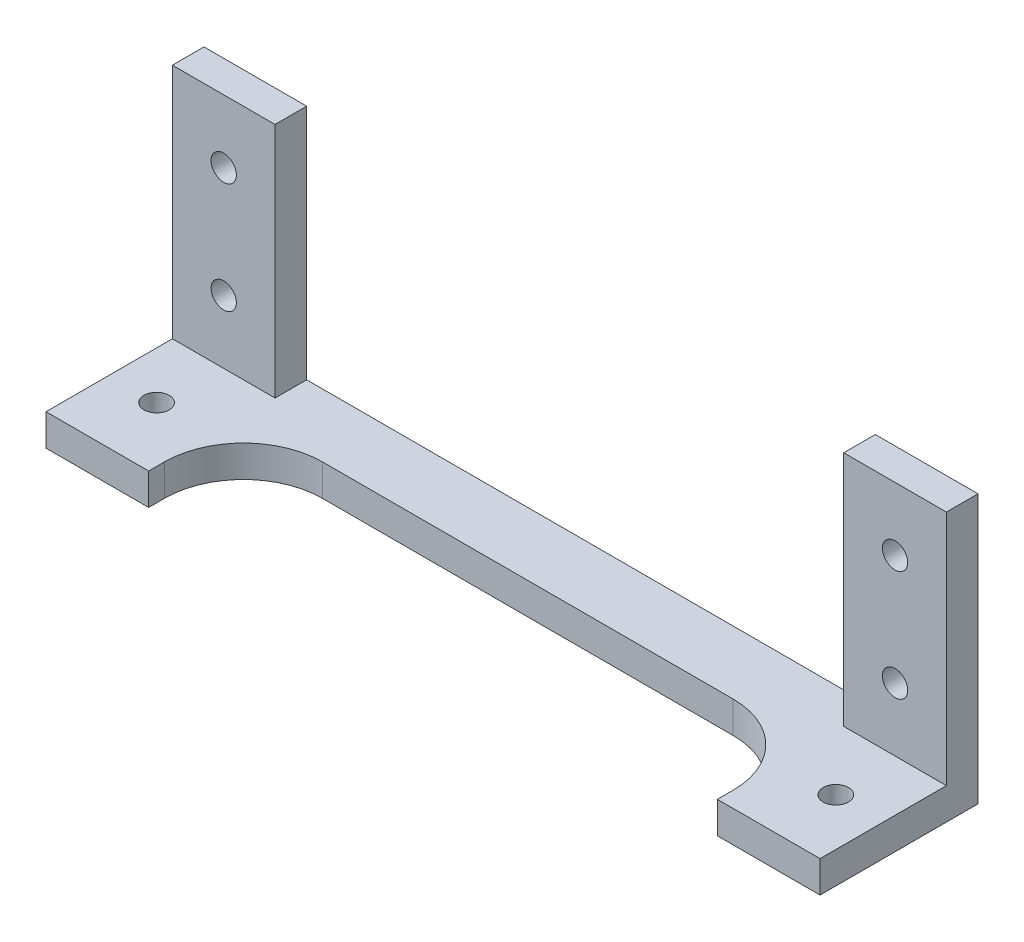
ISO-10303-21;
HEADER;
FILE_DESCRIPTION(('STEP AP214'),'2;1');
FILE_NAME('part.step','',(''),(''),'','','');
FILE_SCHEMA(('AUTOMOTIVE_DESIGN { 1 0 10303 214 1 1 1 1 }'));
ENDSEC;
DATA;
#1=APPLICATION_CONTEXT('core data for automotive mechanical design processes');
#2=APPLICATION_PROTOCOL_DEFINITION('international standard','automotive_design',2000,#1);
#3=PRODUCT_CONTEXT('',#1,'mechanical');
#4=PRODUCT('Part','Part','',(#3));
#5=PRODUCT_RELATED_PRODUCT_CATEGORY('part','',(#4));
#6=PRODUCT_DEFINITION_FORMATION('','',#4);
#7=PRODUCT_DEFINITION_CONTEXT('part definition',#1,'design');
#8=PRODUCT_DEFINITION('design','',#6,#7);
#9=PRODUCT_DEFINITION_SHAPE('','',#8);
#10=(LENGTH_UNIT() NAMED_UNIT(*) SI_UNIT(.MILLI.,.METRE.));
#11=(NAMED_UNIT(*) PLANE_ANGLE_UNIT() SI_UNIT($,.RADIAN.));
#12=(NAMED_UNIT(*) SI_UNIT($,.STERADIAN.) SOLID_ANGLE_UNIT());
#13=UNCERTAINTY_MEASURE_WITH_UNIT(LENGTH_MEASURE(1.E-05),#10,'distance_accuracy_value','');
#14=(GEOMETRIC_REPRESENTATION_CONTEXT(3) GLOBAL_UNCERTAINTY_ASSIGNED_CONTEXT((#13)) GLOBAL_UNIT_ASSIGNED_CONTEXT((#10,
#11,#12)) REPRESENTATION_CONTEXT('',''));
#15=CARTESIAN_POINT('',(0.,0.,0.));
#16=DIRECTION('',(0.,0.,1.));
#17=DIRECTION('',(1.,0.,0.));
#18=AXIS2_PLACEMENT_3D('',#15,#16,#17);
#19=CARTESIAN_POINT('',(0.,0.,10.));
#20=DIRECTION('',(0.,0.,-1.));
#21=DIRECTION('',(-1.,0.,0.));
#22=AXIS2_PLACEMENT_3D('',#19,#20,#21);
#23=PLANE('',#22);
#24=DIRECTION('',(1.,0.,0.));
#25=VECTOR('',#24,1.);
#26=CARTESIAN_POINT('',(0.,0.,10.));
#27=LINE('',#26,#25);
#28=CARTESIAN_POINT('',(0.,0.,10.));
#29=VERTEX_POINT('',#28);
#30=CARTESIAN_POINT('',(6.5,0.,10.));
#31=VERTEX_POINT('',#30);
#32=EDGE_CURVE('E238',#29,#31,#27,.T.);
#33=ORIENTED_EDGE('',*,*,#32,.T.);
#34=DIRECTION('',(0.,1.,0.));
#35=VECTOR('',#34,1.);
#36=CARTESIAN_POINT('',(6.5,0.,10.));
#37=LINE('',#36,#35);
#38=CARTESIAN_POINT('',(6.5,2.,10.));
#39=VERTEX_POINT('',#38);
#40=EDGE_CURVE('E190',#31,#39,#37,.T.);
#41=ORIENTED_EDGE('',*,*,#40,.T.);
#42=DIRECTION('',(-1.,0.,0.));
#43=VECTOR('',#42,1.);
#44=CARTESIAN_POINT('',(0.,2.,10.));
#45=LINE('',#44,#43);
#46=CARTESIAN_POINT('',(0.,2.,10.));
#47=VERTEX_POINT('',#46);
#48=EDGE_CURVE('E243',#39,#47,#45,.T.);
#49=ORIENTED_EDGE('',*,*,#48,.T.);
#50=DIRECTION('',(0.,-1.,0.));
#51=VECTOR('',#50,1.);
#52=CARTESIAN_POINT('',(0.,0.,10.));
#53=LINE('',#52,#51);
#54=EDGE_CURVE('E235',#47,#29,#53,.T.);
#55=ORIENTED_EDGE('',*,*,#54,.T.);
#56=EDGE_LOOP('',(#33,#41,#49,#55));
#57=FACE_BOUND('',#56,.T.);
#58=ADVANCED_FACE('F34',(#57),#23,.F.);
#59=CARTESIAN_POINT('',(0.,0.,2.));
#60=DIRECTION('',(0.,0.,-1.));
#61=DIRECTION('',(-1.,0.,0.));
#62=AXIS2_PLACEMENT_3D('',#59,#60,#61);
#63=PLANE('',#62);
#64=CARTESIAN_POINT('',(45.75,6.,2.));
#65=DIRECTION('',(0.,0.,1.));
#66=DIRECTION('',(1.,0.,0.));
#67=AXIS2_PLACEMENT_3D('',#64,#65,#66);
#68=CIRCLE('',#67,0.799999999999996);
#69=CARTESIAN_POINT('',(46.55,6.,2.));
#70=VERTEX_POINT('',#69);
#71=EDGE_CURVE('E209',#70,#70,#68,.T.);
#72=ORIENTED_EDGE('',*,*,#71,.F.);
#73=EDGE_LOOP('',(#72));
#74=FACE_BOUND('',#73,.T.);
#75=CARTESIAN_POINT('',(45.75,13.,2.));
#76=DIRECTION('',(0.,0.,1.));
#77=DIRECTION('',(1.,0.,0.));
#78=AXIS2_PLACEMENT_3D('',#75,#76,#77);
#79=CIRCLE('',#78,0.799999999999996);
#80=CARTESIAN_POINT('',(46.55,13.,2.));
#81=VERTEX_POINT('',#80);
#82=EDGE_CURVE('E215',#81,#81,#79,.T.);
#83=ORIENTED_EDGE('',*,*,#82,.F.);
#84=EDGE_LOOP('',(#83));
#85=FACE_BOUND('',#84,.T.);
#86=DIRECTION('',(-1.,0.,0.));
#87=VECTOR('',#86,1.);
#88=CARTESIAN_POINT('',(0.,2.,2.));
#89=LINE('',#88,#87);
#90=CARTESIAN_POINT('',(49.,2.,2.));
#91=VERTEX_POINT('',#90);
#92=CARTESIAN_POINT('',(42.5,2.,2.));
#93=VERTEX_POINT('',#92);
#94=EDGE_CURVE('E59',#91,#93,#89,.T.);
#95=ORIENTED_EDGE('',*,*,#94,.F.);
#96=DIRECTION('',(0.,1.,0.));
#97=VECTOR('',#96,1.);
#98=CARTESIAN_POINT('',(49.,0.,2.));
#99=LINE('',#98,#97);
#100=CARTESIAN_POINT('',(49.,17.,2.));
#101=VERTEX_POINT('',#100);
#102=EDGE_CURVE('E254',#91,#101,#99,.T.);
#103=ORIENTED_EDGE('',*,*,#102,.T.);
#104=DIRECTION('',(-1.,0.,0.));
#105=VECTOR('',#104,1.);
#106=CARTESIAN_POINT('',(42.5,17.,2.));
#107=LINE('',#106,#105);
#108=CARTESIAN_POINT('',(42.5,17.,2.));
#109=VERTEX_POINT('',#108);
#110=EDGE_CURVE('E276',#101,#109,#107,.T.);
#111=ORIENTED_EDGE('',*,*,#110,.T.);
#112=DIRECTION('',(0.,-1.,0.));
#113=VECTOR('',#112,1.);
#114=CARTESIAN_POINT('',(42.5,2.,2.));
#115=LINE('',#114,#113);
#116=EDGE_CURVE('E272',#109,#93,#115,.T.);
#117=ORIENTED_EDGE('',*,*,#116,.T.);
#118=EDGE_LOOP('',(#95,#103,#111,#117));
#119=FACE_BOUND('',#118,.T.);
#120=ADVANCED_FACE('F329',(#74,#85,#119),#63,.F.);
#121=CARTESIAN_POINT('',(3.25,6.,2.));
#122=DIRECTION('',(0.,0.,1.));
#123=DIRECTION('',(1.,0.,0.));
#124=AXIS2_PLACEMENT_3D('',#121,#122,#123);
#125=CIRCLE('',#124,0.8);
#126=CARTESIAN_POINT('',(4.05,6.,2.));
#127=VERTEX_POINT('',#126);
#128=EDGE_CURVE('E221',#127,#127,#125,.T.);
#129=ORIENTED_EDGE('',*,*,#128,.F.);
#130=EDGE_LOOP('',(#129));
#131=FACE_BOUND('',#130,.T.);
#132=CARTESIAN_POINT('',(3.25,13.,2.));
#133=DIRECTION('',(0.,0.,1.));
#134=DIRECTION('',(1.,0.,0.));
#135=AXIS2_PLACEMENT_3D('',#132,#133,#134);
#136=CIRCLE('',#135,0.8);
#137=CARTESIAN_POINT('',(4.05,13.,2.));
#138=VERTEX_POINT('',#137);
#139=EDGE_CURVE('E227',#138,#138,#136,.T.);
#140=ORIENTED_EDGE('',*,*,#139,.F.);
#141=EDGE_LOOP('',(#140));
#142=FACE_BOUND('',#141,.T.);
#143=CARTESIAN_POINT('',(6.5,2.,2.));
#144=VERTEX_POINT('',#143);
#145=CARTESIAN_POINT('',(0.,2.,2.));
#146=VERTEX_POINT('',#145);
#147=EDGE_CURVE('E11',#144,#146,#89,.T.);
#148=ORIENTED_EDGE('',*,*,#147,.F.);
#149=DIRECTION('',(0.,1.,0.));
#150=VECTOR('',#149,1.);
#151=CARTESIAN_POINT('',(6.5,17.,2.));
#152=LINE('',#151,#150);
#153=CARTESIAN_POINT('',(6.5,17.,2.));
#154=VERTEX_POINT('',#153);
#155=EDGE_CURVE('E269',#144,#154,#152,.T.);
#156=ORIENTED_EDGE('',*,*,#155,.T.);
#157=DIRECTION('',(-1.,0.,0.));
#158=VECTOR('',#157,1.);
#159=CARTESIAN_POINT('',(0.,17.,2.));
#160=LINE('',#159,#158);
#161=CARTESIAN_POINT('',(0.,17.,2.));
#162=VERTEX_POINT('',#161);
#163=EDGE_CURVE('E271',#154,#162,#160,.T.);
#164=ORIENTED_EDGE('',*,*,#163,.T.);
#165=DIRECTION('',(0.,-1.,0.));
#166=VECTOR('',#165,1.);
#167=CARTESIAN_POINT('',(0.,0.,2.));
#168=LINE('',#167,#166);
#169=EDGE_CURVE('E310',#162,#146,#168,.T.);
#170=ORIENTED_EDGE('',*,*,#169,.T.);
#171=EDGE_LOOP('',(#148,#156,#164,#170));
#172=FACE_BOUND('',#171,.T.);
#173=ADVANCED_FACE('F367',(#131,#142,#172),#63,.F.);
#174=CARTESIAN_POINT('',(0.,0.,2.));
#175=DIRECTION('',(1.,0.,0.));
#176=DIRECTION('',(0.,0.,-1.));
#177=AXIS2_PLACEMENT_3D('',#174,#175,#176);
#178=PLANE('',#177);
#179=DIRECTION('',(0.,-1.,0.));
#180=VECTOR('',#179,1.);
#181=CARTESIAN_POINT('',(0.,0.,0.));
#182=LINE('',#181,#180);
#183=CARTESIAN_POINT('',(0.,17.,0.));
#184=VERTEX_POINT('',#183);
#185=CARTESIAN_POINT('',(0.,0.,0.));
#186=VERTEX_POINT('',#185);
#187=EDGE_CURVE('E284',#184,#186,#182,.T.);
#188=ORIENTED_EDGE('',*,*,#187,.T.);
#189=DIRECTION('',(0.,0.,-1.));
#190=VECTOR('',#189,1.);
#191=CARTESIAN_POINT('',(0.,0.,2.));
#192=LINE('',#191,#190);
#193=EDGE_CURVE('E43',#29,#186,#192,.T.);
#194=ORIENTED_EDGE('',*,*,#193,.F.);
#195=ORIENTED_EDGE('',*,*,#54,.F.);
#196=DIRECTION('',(0.,0.,-1.));
#197=VECTOR('',#196,1.);
#198=CARTESIAN_POINT('',(0.,2.,10.));
#199=LINE('',#198,#197);
#200=EDGE_CURVE('E247',#47,#146,#199,.T.);
#201=ORIENTED_EDGE('',*,*,#200,.T.);
#202=ORIENTED_EDGE('',*,*,#169,.F.);
#203=DIRECTION('',(0.,0.,-1.));
#204=VECTOR('',#203,1.);
#205=CARTESIAN_POINT('',(0.,17.,2.));
#206=LINE('',#205,#204);
#207=EDGE_CURVE('E311',#162,#184,#206,.T.);
#208=ORIENTED_EDGE('',*,*,#207,.T.);
#209=EDGE_LOOP('',(#188,#194,#195,#201,#202,#208));
#210=FACE_BOUND('',#209,.T.);
#211=ADVANCED_FACE('F36',(#210),#178,.F.);
#212=CARTESIAN_POINT('',(0.,0.,2.));
#213=DIRECTION('',(0.,1.,0.));
#214=DIRECTION('',(0.,0.,1.));
#215=AXIS2_PLACEMENT_3D('',#212,#213,#214);
#216=PLANE('',#215);
#217=CARTESIAN_POINT('',(46.,0.,6.));
#218=DIRECTION('',(0.,1.,0.));
#219=DIRECTION('',(0.,0.,1.));
#220=AXIS2_PLACEMENT_3D('',#217,#218,#219);
#221=CIRCLE('',#220,0.800000000000002);
#222=CARTESIAN_POINT('',(46.,0.,6.8));
#223=VERTEX_POINT('',#222);
#224=EDGE_CURVE('E200',#223,#223,#221,.T.);
#225=ORIENTED_EDGE('',*,*,#224,.T.);
#226=EDGE_LOOP('',(#225));
#227=FACE_BOUND('',#226,.T.);
#228=CARTESIAN_POINT('',(3.,0.,6.));
#229=DIRECTION('',(0.,1.,0.));
#230=DIRECTION('',(0.,0.,1.));
#231=AXIS2_PLACEMENT_3D('',#228,#229,#230);
#232=CIRCLE('',#231,0.800000000000001);
#233=CARTESIAN_POINT('',(3.,0.,6.8));
#234=VERTEX_POINT('',#233);
#235=EDGE_CURVE('E206',#234,#234,#232,.T.);
#236=ORIENTED_EDGE('',*,*,#235,.T.);
#237=EDGE_LOOP('',(#236));
#238=FACE_BOUND('',#237,.T.);
#239=CARTESIAN_POINT('',(11.5,0.,9.));
#240=DIRECTION('',(0.,1.,0.));
#241=DIRECTION('',(0.,0.,-1.));
#242=AXIS2_PLACEMENT_3D('',#239,#240,#241);
#243=CIRCLE('',#242,5.);
#244=CARTESIAN_POINT('',(11.5,0.,4.));
#245=VERTEX_POINT('',#244);
#246=CARTESIAN_POINT('',(6.5,0.,9.00000000000004));
#247=VERTEX_POINT('',#246);
#248=EDGE_CURVE('E177',#245,#247,#243,.T.);
#249=ORIENTED_EDGE('',*,*,#248,.T.);
#250=DIRECTION('',(0.,0.,1.));
#251=VECTOR('',#250,1.);
#252=CARTESIAN_POINT('',(6.5,0.,10.));
#253=LINE('',#252,#251);
#254=EDGE_CURVE('E179',#247,#31,#253,.T.);
#255=ORIENTED_EDGE('',*,*,#254,.T.);
#256=ORIENTED_EDGE('',*,*,#32,.F.);
#257=ORIENTED_EDGE('',*,*,#193,.T.);
#258=DIRECTION('',(1.,0.,0.));
#259=VECTOR('',#258,1.);
#260=CARTESIAN_POINT('',(0.,0.,0.));
#261=LINE('',#260,#259);
#262=CARTESIAN_POINT('',(49.,0.,0.));
#263=VERTEX_POINT('',#262);
#264=EDGE_CURVE('E289',#186,#263,#261,.T.);
#265=ORIENTED_EDGE('',*,*,#264,.T.);
#266=DIRECTION('',(0.,0.,-1.));
#267=VECTOR('',#266,1.);
#268=CARTESIAN_POINT('',(49.,0.,2.));
#269=LINE('',#268,#267);
#270=CARTESIAN_POINT('',(49.,0.,10.));
#271=VERTEX_POINT('',#270);
#272=EDGE_CURVE('E320',#271,#263,#269,.T.);
#273=ORIENTED_EDGE('',*,*,#272,.F.);
#274=CARTESIAN_POINT('',(42.5,0.,10.));
#275=VERTEX_POINT('',#274);
#276=EDGE_CURVE('E170',#275,#271,#27,.T.);
#277=ORIENTED_EDGE('',*,*,#276,.F.);
#278=DIRECTION('',(0.,0.,-1.));
#279=VECTOR('',#278,1.);
#280=CARTESIAN_POINT('',(42.5,0.,9.00000000000004));
#281=LINE('',#280,#279);
#282=CARTESIAN_POINT('',(42.5,0.,9.00000000000004));
#283=VERTEX_POINT('',#282);
#284=EDGE_CURVE('E51',#275,#283,#281,.T.);
#285=ORIENTED_EDGE('',*,*,#284,.T.);
#286=CARTESIAN_POINT('',(37.5,0.,9.));
#287=DIRECTION('',(0.,1.,0.));
#288=DIRECTION('',(0.,0.,-1.));
#289=AXIS2_PLACEMENT_3D('',#286,#287,#288);
#290=CIRCLE('',#289,5.);
#291=CARTESIAN_POINT('',(37.5,0.,4.));
#292=VERTEX_POINT('',#291);
#293=EDGE_CURVE('E159',#283,#292,#290,.T.);
#294=ORIENTED_EDGE('',*,*,#293,.T.);
#295=DIRECTION('',(-1.,0.,0.));
#296=VECTOR('',#295,1.);
#297=CARTESIAN_POINT('',(11.5,0.,4.));
#298=LINE('',#297,#296);
#299=EDGE_CURVE('E164',#292,#245,#298,.T.);
#300=ORIENTED_EDGE('',*,*,#299,.T.);
#301=EDGE_LOOP('',(#249,#255,#256,#257,#265,#273,#277,#285,#294,#300));
#302=FACE_BOUND('',#301,.T.);
#303=ADVANCED_FACE('F168',(#227,#238,#302),#216,.F.);
#304=CARTESIAN_POINT('',(49.,0.,2.));
#305=DIRECTION('',(-1.,0.,0.));
#306=DIRECTION('',(0.,0.,1.));
#307=AXIS2_PLACEMENT_3D('',#304,#305,#306);
#308=PLANE('',#307);
#309=DIRECTION('',(0.,1.,0.));
#310=VECTOR('',#309,1.);
#311=CARTESIAN_POINT('',(49.,0.,0.));
#312=LINE('',#311,#310);
#313=CARTESIAN_POINT('',(49.,17.,0.));
#314=VERTEX_POINT('',#313);
#315=EDGE_CURVE('E294',#263,#314,#312,.T.);
#316=ORIENTED_EDGE('',*,*,#315,.T.);
#317=DIRECTION('',(0.,0.,-1.));
#318=VECTOR('',#317,1.);
#319=CARTESIAN_POINT('',(49.,17.,2.));
#320=LINE('',#319,#318);
#321=EDGE_CURVE('E317',#101,#314,#320,.T.);
#322=ORIENTED_EDGE('',*,*,#321,.F.);
#323=ORIENTED_EDGE('',*,*,#102,.F.);
#324=DIRECTION('',(0.,0.,-1.));
#325=VECTOR('',#324,1.);
#326=CARTESIAN_POINT('',(49.,2.,10.));
#327=LINE('',#326,#325);
#328=CARTESIAN_POINT('',(49.,2.,10.));
#329=VERTEX_POINT('',#328);
#330=EDGE_CURVE('E259',#329,#91,#327,.T.);
#331=ORIENTED_EDGE('',*,*,#330,.F.);
#332=DIRECTION('',(0.,1.,0.));
#333=VECTOR('',#332,1.);
#334=CARTESIAN_POINT('',(49.,0.,10.));
#335=LINE('',#334,#333);
#336=EDGE_CURVE('E241',#271,#329,#335,.T.);
#337=ORIENTED_EDGE('',*,*,#336,.F.);
#338=ORIENTED_EDGE('',*,*,#272,.T.);
#339=EDGE_LOOP('',(#316,#322,#323,#331,#337,#338));
#340=FACE_BOUND('',#339,.T.);
#341=ADVANCED_FACE('F331',(#340),#308,.F.);
#342=CARTESIAN_POINT('',(42.5,17.,2.));
#343=DIRECTION('',(0.,-1.,0.));
#344=DIRECTION('',(0.,0.,-1.));
#345=AXIS2_PLACEMENT_3D('',#342,#343,#344);
#346=PLANE('',#345);
#347=DIRECTION('',(-1.,0.,0.));
#348=VECTOR('',#347,1.);
#349=CARTESIAN_POINT('',(42.5,17.,0.));
#350=LINE('',#349,#348);
#351=CARTESIAN_POINT('',(42.5,17.,0.));
#352=VERTEX_POINT('',#351);
#353=EDGE_CURVE('E300',#314,#352,#350,.T.);
#354=ORIENTED_EDGE('',*,*,#353,.T.);
#355=DIRECTION('',(0.,0.,-1.));
#356=VECTOR('',#355,1.);
#357=CARTESIAN_POINT('',(42.5,17.,2.));
#358=LINE('',#357,#356);
#359=EDGE_CURVE('E281',#109,#352,#358,.T.);
#360=ORIENTED_EDGE('',*,*,#359,.F.);
#361=ORIENTED_EDGE('',*,*,#110,.F.);
#362=ORIENTED_EDGE('',*,*,#321,.T.);
#363=EDGE_LOOP('',(#354,#360,#361,#362));
#364=FACE_BOUND('',#363,.T.);
#365=ADVANCED_FACE('F335',(#364),#346,.F.);
#366=CARTESIAN_POINT('',(42.5,2.,2.));
#367=DIRECTION('',(1.,0.,0.));
#368=DIRECTION('',(0.,0.,-1.));
#369=AXIS2_PLACEMENT_3D('',#366,#367,#368);
#370=PLANE('',#369);
#371=DIRECTION('',(0.,-1.,0.));
#372=VECTOR('',#371,1.);
#373=CARTESIAN_POINT('',(42.5,2.,0.));
#374=LINE('',#373,#372);
#375=CARTESIAN_POINT('',(42.5,2.,0.));
#376=VERTEX_POINT('',#375);
#377=EDGE_CURVE('E302',#352,#376,#374,.T.);
#378=ORIENTED_EDGE('',*,*,#377,.T.);
#379=DIRECTION('',(0.,0.,-1.));
#380=VECTOR('',#379,1.);
#381=CARTESIAN_POINT('',(42.5,2.,2.));
#382=LINE('',#381,#380);
#383=EDGE_CURVE('E265',#93,#376,#382,.T.);
#384=ORIENTED_EDGE('',*,*,#383,.F.);
#385=ORIENTED_EDGE('',*,*,#116,.F.);
#386=ORIENTED_EDGE('',*,*,#359,.T.);
#387=EDGE_LOOP('',(#378,#384,#385,#386));
#388=FACE_BOUND('',#387,.T.);
#389=ADVANCED_FACE('F340',(#388),#370,.F.);
#390=CARTESIAN_POINT('',(6.5,2.,2.));
#391=DIRECTION('',(0.,-1.,0.));
#392=DIRECTION('',(0.,0.,-1.));
#393=AXIS2_PLACEMENT_3D('',#390,#391,#392);
#394=PLANE('',#393);
#395=CARTESIAN_POINT('',(46.,2.,6.));
#396=DIRECTION('',(0.,1.,0.));
#397=DIRECTION('',(0.,0.,1.));
#398=AXIS2_PLACEMENT_3D('',#395,#396,#397);
#399=CIRCLE('',#398,0.800000000000002);
#400=CARTESIAN_POINT('',(46.,2.,6.8));
#401=VERTEX_POINT('',#400);
#402=EDGE_CURVE('E193',#401,#401,#399,.T.);
#403=ORIENTED_EDGE('',*,*,#402,.F.);
#404=EDGE_LOOP('',(#403));
#405=FACE_BOUND('',#404,.T.);
#406=CARTESIAN_POINT('',(3.,2.,6.));
#407=DIRECTION('',(0.,1.,0.));
#408=DIRECTION('',(0.,0.,1.));
#409=AXIS2_PLACEMENT_3D('',#406,#407,#408);
#410=CIRCLE('',#409,0.800000000000001);
#411=CARTESIAN_POINT('',(3.,2.,6.8));
#412=VERTEX_POINT('',#411);
#413=EDGE_CURVE('E203',#412,#412,#410,.T.);
#414=ORIENTED_EDGE('',*,*,#413,.F.);
#415=EDGE_LOOP('',(#414));
#416=FACE_BOUND('',#415,.T.);
#417=ORIENTED_EDGE('',*,*,#48,.F.);
#418=DIRECTION('',(0.,0.,1.));
#419=VECTOR('',#418,1.);
#420=CARTESIAN_POINT('',(6.5,2.,10.));
#421=LINE('',#420,#419);
#422=CARTESIAN_POINT('',(6.5,2.,9.00000000000004));
#423=VERTEX_POINT('',#422);
#424=EDGE_CURVE('E171',#423,#39,#421,.T.);
#425=ORIENTED_EDGE('',*,*,#424,.F.);
#426=CARTESIAN_POINT('',(11.5,2.,9.));
#427=DIRECTION('',(0.,1.,0.));
#428=DIRECTION('',(0.,0.,-1.));
#429=AXIS2_PLACEMENT_3D('',#426,#427,#428);
#430=CIRCLE('',#429,5.);
#431=CARTESIAN_POINT('',(11.5,2.,4.));
#432=VERTEX_POINT('',#431);
#433=EDGE_CURVE('E173',#432,#423,#430,.T.);
#434=ORIENTED_EDGE('',*,*,#433,.F.);
#435=DIRECTION('',(-1.,0.,0.));
#436=VECTOR('',#435,1.);
#437=CARTESIAN_POINT('',(11.5,2.,4.));
#438=LINE('',#437,#436);
#439=CARTESIAN_POINT('',(37.5,2.,4.));
#440=VERTEX_POINT('',#439);
#441=EDGE_CURVE('E185',#440,#432,#438,.T.);
#442=ORIENTED_EDGE('',*,*,#441,.F.);
#443=CARTESIAN_POINT('',(37.5,2.,9.));
#444=DIRECTION('',(0.,1.,0.));
#445=DIRECTION('',(0.,0.,-1.));
#446=AXIS2_PLACEMENT_3D('',#443,#444,#445);
#447=CIRCLE('',#446,5.);
#448=CARTESIAN_POINT('',(42.5,2.,9.00000000000004));
#449=VERTEX_POINT('',#448);
#450=EDGE_CURVE('E183',#449,#440,#447,.T.);
#451=ORIENTED_EDGE('',*,*,#450,.F.);
#452=DIRECTION('',(0.,0.,-1.));
#453=VECTOR('',#452,1.);
#454=CARTESIAN_POINT('',(42.5,2.,9.00000000000004));
#455=LINE('',#454,#453);
#456=CARTESIAN_POINT('',(42.5,2.,10.));
#457=VERTEX_POINT('',#456);
#458=EDGE_CURVE('E151',#457,#449,#455,.T.);
#459=ORIENTED_EDGE('',*,*,#458,.F.);
#460=EDGE_CURVE('E244',#329,#457,#45,.T.);
#461=ORIENTED_EDGE('',*,*,#460,.F.);
#462=ORIENTED_EDGE('',*,*,#330,.T.);
#463=ORIENTED_EDGE('',*,*,#94,.T.);
#464=ORIENTED_EDGE('',*,*,#383,.T.);
#465=DIRECTION('',(-1.,0.,0.));
#466=VECTOR('',#465,1.);
#467=CARTESIAN_POINT('',(6.5,2.,0.));
#468=LINE('',#467,#466);
#469=CARTESIAN_POINT('',(6.5,2.,0.));
#470=VERTEX_POINT('',#469);
#471=EDGE_CURVE('E304',#376,#470,#468,.T.);
#472=ORIENTED_EDGE('',*,*,#471,.T.);
#473=DIRECTION('',(0.,0.,-1.));
#474=VECTOR('',#473,1.);
#475=CARTESIAN_POINT('',(6.5,2.,2.));
#476=LINE('',#475,#474);
#477=EDGE_CURVE('E262',#144,#470,#476,.T.);
#478=ORIENTED_EDGE('',*,*,#477,.F.);
#479=ORIENTED_EDGE('',*,*,#147,.T.);
#480=ORIENTED_EDGE('',*,*,#200,.F.);
#481=EDGE_LOOP('',(#417,#425,#434,#442,#451,#459,#461,#462,#463,#464,#472,#478,#479,#480));
#482=FACE_BOUND('',#481,.T.);
#483=ADVANCED_FACE('F343',(#405,#416,#482),#394,.F.);
#484=CARTESIAN_POINT('',(6.5,17.,2.));
#485=DIRECTION('',(-1.,0.,0.));
#486=DIRECTION('',(0.,-1.,0.));
#487=AXIS2_PLACEMENT_3D('',#484,#485,#486);
#488=PLANE('',#487);
#489=DIRECTION('',(0.,1.,0.));
#490=VECTOR('',#489,1.);
#491=CARTESIAN_POINT('',(6.5,17.,0.));
#492=LINE('',#491,#490);
#493=CARTESIAN_POINT('',(6.5,17.,0.));
#494=VERTEX_POINT('',#493);
#495=EDGE_CURVE('E306',#470,#494,#492,.T.);
#496=ORIENTED_EDGE('',*,*,#495,.T.);
#497=DIRECTION('',(0.,0.,-1.));
#498=VECTOR('',#497,1.);
#499=CARTESIAN_POINT('',(6.5,17.,2.));
#500=LINE('',#499,#498);
#501=EDGE_CURVE('E266',#154,#494,#500,.T.);
#502=ORIENTED_EDGE('',*,*,#501,.F.);
#503=ORIENTED_EDGE('',*,*,#155,.F.);
#504=ORIENTED_EDGE('',*,*,#477,.T.);
#505=EDGE_LOOP('',(#496,#502,#503,#504));
#506=FACE_BOUND('',#505,.T.);
#507=ADVANCED_FACE('F347',(#506),#488,.F.);
#508=CARTESIAN_POINT('',(0.,17.,2.));
#509=DIRECTION('',(0.,-1.,0.));
#510=DIRECTION('',(0.,0.,-1.));
#511=AXIS2_PLACEMENT_3D('',#508,#509,#510);
#512=PLANE('',#511);
#513=DIRECTION('',(-1.,0.,0.));
#514=VECTOR('',#513,1.);
#515=CARTESIAN_POINT('',(0.,17.,0.));
#516=LINE('',#515,#514);
#517=EDGE_CURVE('E308',#494,#184,#516,.T.);
#518=ORIENTED_EDGE('',*,*,#517,.T.);
#519=ORIENTED_EDGE('',*,*,#207,.F.);
#520=ORIENTED_EDGE('',*,*,#163,.F.);
#521=ORIENTED_EDGE('',*,*,#501,.T.);
#522=EDGE_LOOP('',(#518,#519,#520,#521));
#523=FACE_BOUND('',#522,.T.);
#524=ADVANCED_FACE('F354',(#523),#512,.F.);
#525=CARTESIAN_POINT('',(0.,0.,0.));
#526=DIRECTION('',(0.,0.,-1.));
#527=DIRECTION('',(-1.,0.,0.));
#528=AXIS2_PLACEMENT_3D('',#525,#526,#527);
#529=PLANE('',#528);
#530=CARTESIAN_POINT('',(45.75,6.,0.));
#531=DIRECTION('',(0.,0.,1.));
#532=DIRECTION('',(1.,0.,0.));
#533=AXIS2_PLACEMENT_3D('',#530,#531,#532);
#534=CIRCLE('',#533,0.799999999999996);
#535=CARTESIAN_POINT('',(46.55,6.,0.));
#536=VERTEX_POINT('',#535);
#537=EDGE_CURVE('E212',#536,#536,#534,.T.);
#538=ORIENTED_EDGE('',*,*,#537,.T.);
#539=EDGE_LOOP('',(#538));
#540=FACE_BOUND('',#539,.T.);
#541=CARTESIAN_POINT('',(45.75,13.,0.));
#542=DIRECTION('',(0.,0.,1.));
#543=DIRECTION('',(1.,0.,0.));
#544=AXIS2_PLACEMENT_3D('',#541,#542,#543);
#545=CIRCLE('',#544,0.799999999999996);
#546=CARTESIAN_POINT('',(46.55,13.,0.));
#547=VERTEX_POINT('',#546);
#548=EDGE_CURVE('E218',#547,#547,#545,.T.);
#549=ORIENTED_EDGE('',*,*,#548,.T.);
#550=EDGE_LOOP('',(#549));
#551=FACE_BOUND('',#550,.T.);
#552=CARTESIAN_POINT('',(3.25,6.,0.));
#553=DIRECTION('',(0.,0.,1.));
#554=DIRECTION('',(1.,0.,0.));
#555=AXIS2_PLACEMENT_3D('',#552,#553,#554);
#556=CIRCLE('',#555,0.8);
#557=CARTESIAN_POINT('',(4.05,6.,0.));
#558=VERTEX_POINT('',#557);
#559=EDGE_CURVE('E224',#558,#558,#556,.T.);
#560=ORIENTED_EDGE('',*,*,#559,.T.);
#561=EDGE_LOOP('',(#560));
#562=FACE_BOUND('',#561,.T.);
#563=CARTESIAN_POINT('',(3.25,13.,0.));
#564=DIRECTION('',(0.,0.,1.));
#565=DIRECTION('',(1.,0.,0.));
#566=AXIS2_PLACEMENT_3D('',#563,#564,#565);
#567=CIRCLE('',#566,0.8);
#568=CARTESIAN_POINT('',(4.05,13.,0.));
#569=VERTEX_POINT('',#568);
#570=EDGE_CURVE('E230',#569,#569,#567,.T.);
#571=ORIENTED_EDGE('',*,*,#570,.T.);
#572=EDGE_LOOP('',(#571));
#573=FACE_BOUND('',#572,.T.);
#574=ORIENTED_EDGE('',*,*,#187,.F.);
#575=ORIENTED_EDGE('',*,*,#517,.F.);
#576=ORIENTED_EDGE('',*,*,#495,.F.);
#577=ORIENTED_EDGE('',*,*,#471,.F.);
#578=ORIENTED_EDGE('',*,*,#377,.F.);
#579=ORIENTED_EDGE('',*,*,#353,.F.);
#580=ORIENTED_EDGE('',*,*,#315,.F.);
#581=ORIENTED_EDGE('',*,*,#264,.F.);
#582=EDGE_LOOP('',(#574,#575,#576,#577,#578,#579,#580,#581));
#583=FACE_BOUND('',#582,.T.);
#584=ADVANCED_FACE('F373',(#540,#551,#562,#573,#583),#529,.T.);
#585=ORIENTED_EDGE('',*,*,#460,.T.);
#586=DIRECTION('',(0.,1.,0.));
#587=VECTOR('',#586,1.);
#588=CARTESIAN_POINT('',(42.5,0.,10.));
#589=LINE('',#588,#587);
#590=EDGE_CURVE('E156',#275,#457,#589,.T.);
#591=ORIENTED_EDGE('',*,*,#590,.F.);
#592=ORIENTED_EDGE('',*,*,#276,.T.);
#593=ORIENTED_EDGE('',*,*,#336,.T.);
#594=EDGE_LOOP('',(#585,#591,#592,#593));
#595=FACE_BOUND('',#594,.T.);
#596=ADVANCED_FACE('F363',(#595),#23,.F.);
#597=CARTESIAN_POINT('',(3.25,13.,0.));
#598=DIRECTION('',(0.,0.,1.));
#599=DIRECTION('',(1.,0.,0.));
#600=AXIS2_PLACEMENT_3D('',#597,#598,#599);
#601=CYLINDRICAL_SURFACE('',#600,0.8);
#602=ORIENTED_EDGE('',*,*,#570,.F.);
#603=EDGE_LOOP('',(#602));
#604=FACE_BOUND('',#603,.T.);
#605=ORIENTED_EDGE('',*,*,#139,.T.);
#606=EDGE_LOOP('',(#605));
#607=FACE_BOUND('',#606,.T.);
#608=ADVANCED_FACE('F372',(#604,#607),#601,.F.);
#609=CARTESIAN_POINT('',(3.25,6.,0.));
#610=DIRECTION('',(0.,0.,1.));
#611=DIRECTION('',(1.,0.,0.));
#612=AXIS2_PLACEMENT_3D('',#609,#610,#611);
#613=CYLINDRICAL_SURFACE('',#612,0.8);
#614=ORIENTED_EDGE('',*,*,#559,.F.);
#615=EDGE_LOOP('',(#614));
#616=FACE_BOUND('',#615,.T.);
#617=ORIENTED_EDGE('',*,*,#128,.T.);
#618=EDGE_LOOP('',(#617));
#619=FACE_BOUND('',#618,.T.);
#620=ADVANCED_FACE('F379',(#616,#619),#613,.F.);
#621=CARTESIAN_POINT('',(45.75,13.,0.));
#622=DIRECTION('',(0.,0.,1.));
#623=DIRECTION('',(1.,0.,0.));
#624=AXIS2_PLACEMENT_3D('',#621,#622,#623);
#625=CYLINDRICAL_SURFACE('',#624,0.799999999999996);
#626=ORIENTED_EDGE('',*,*,#548,.F.);
#627=EDGE_LOOP('',(#626));
#628=FACE_BOUND('',#627,.T.);
#629=ORIENTED_EDGE('',*,*,#82,.T.);
#630=EDGE_LOOP('',(#629));
#631=FACE_BOUND('',#630,.T.);
#632=ADVANCED_FACE('F440',(#628,#631),#625,.F.);
#633=CARTESIAN_POINT('',(45.75,6.,0.));
#634=DIRECTION('',(0.,0.,1.));
#635=DIRECTION('',(1.,0.,0.));
#636=AXIS2_PLACEMENT_3D('',#633,#634,#635);
#637=CYLINDRICAL_SURFACE('',#636,0.799999999999996);
#638=ORIENTED_EDGE('',*,*,#537,.F.);
#639=EDGE_LOOP('',(#638));
#640=FACE_BOUND('',#639,.T.);
#641=ORIENTED_EDGE('',*,*,#71,.T.);
#642=EDGE_LOOP('',(#641));
#643=FACE_BOUND('',#642,.T.);
#644=ADVANCED_FACE('F450',(#640,#643),#637,.F.);
#645=CARTESIAN_POINT('',(3.,0.,6.));
#646=DIRECTION('',(0.,1.,0.));
#647=DIRECTION('',(0.,0.,1.));
#648=AXIS2_PLACEMENT_3D('',#645,#646,#647);
#649=CYLINDRICAL_SURFACE('',#648,0.800000000000001);
#650=ORIENTED_EDGE('',*,*,#235,.F.);
#651=EDGE_LOOP('',(#650));
#652=FACE_BOUND('',#651,.T.);
#653=ORIENTED_EDGE('',*,*,#413,.T.);
#654=EDGE_LOOP('',(#653));
#655=FACE_BOUND('',#654,.T.);
#656=ADVANCED_FACE('F460',(#652,#655),#649,.F.);
#657=CARTESIAN_POINT('',(46.,0.,6.));
#658=DIRECTION('',(0.,1.,0.));
#659=DIRECTION('',(0.,0.,1.));
#660=AXIS2_PLACEMENT_3D('',#657,#658,#659);
#661=CYLINDRICAL_SURFACE('',#660,0.800000000000002);
#662=ORIENTED_EDGE('',*,*,#224,.F.);
#663=EDGE_LOOP('',(#662));
#664=FACE_BOUND('',#663,.T.);
#665=ORIENTED_EDGE('',*,*,#402,.T.);
#666=EDGE_LOOP('',(#665));
#667=FACE_BOUND('',#666,.T.);
#668=ADVANCED_FACE('F470',(#664,#667),#661,.F.);
#669=CARTESIAN_POINT('',(6.5,0.,10.));
#670=DIRECTION('',(-1.,0.,0.));
#671=DIRECTION('',(0.,0.,1.));
#672=AXIS2_PLACEMENT_3D('',#669,#670,#671);
#673=PLANE('',#672);
#674=ORIENTED_EDGE('',*,*,#424,.T.);
#675=ORIENTED_EDGE('',*,*,#40,.F.);
#676=ORIENTED_EDGE('',*,*,#254,.F.);
#677=DIRECTION('',(0.,1.,0.));
#678=VECTOR('',#677,1.);
#679=CARTESIAN_POINT('',(6.5,0.,9.00000000000004));
#680=LINE('',#679,#678);
#681=EDGE_CURVE('E194',#247,#423,#680,.T.);
#682=ORIENTED_EDGE('',*,*,#681,.T.);
#683=EDGE_LOOP('',(#674,#675,#676,#682));
#684=FACE_BOUND('',#683,.T.);
#685=ADVANCED_FACE('F394',(#684),#673,.F.);
#686=CARTESIAN_POINT('',(11.5,0.,9.));
#687=DIRECTION('',(0.,1.,0.));
#688=DIRECTION('',(0.,0.,1.));
#689=AXIS2_PLACEMENT_3D('',#686,#687,#688);
#690=CYLINDRICAL_SURFACE('',#689,5.);
#691=ORIENTED_EDGE('',*,*,#433,.T.);
#692=ORIENTED_EDGE('',*,*,#681,.F.);
#693=ORIENTED_EDGE('',*,*,#248,.F.);
#694=DIRECTION('',(0.,1.,0.));
#695=VECTOR('',#694,1.);
#696=CARTESIAN_POINT('',(11.5,0.,4.));
#697=LINE('',#696,#695);
#698=EDGE_CURVE('E196',#245,#432,#697,.T.);
#699=ORIENTED_EDGE('',*,*,#698,.T.);
#700=EDGE_LOOP('',(#691,#692,#693,#699));
#701=FACE_BOUND('',#700,.T.);
#702=ADVANCED_FACE('F392',(#701),#690,.F.);
#703=CARTESIAN_POINT('',(11.5,0.,4.));
#704=DIRECTION('',(0.,0.,-1.));
#705=DIRECTION('',(-1.,0.,0.));
#706=AXIS2_PLACEMENT_3D('',#703,#704,#705);
#707=PLANE('',#706);
#708=ORIENTED_EDGE('',*,*,#441,.T.);
#709=ORIENTED_EDGE('',*,*,#698,.F.);
#710=ORIENTED_EDGE('',*,*,#299,.F.);
#711=DIRECTION('',(0.,1.,0.));
#712=VECTOR('',#711,1.);
#713=CARTESIAN_POINT('',(37.5,0.,4.));
#714=LINE('',#713,#712);
#715=EDGE_CURVE('E155',#292,#440,#714,.T.);
#716=ORIENTED_EDGE('',*,*,#715,.T.);
#717=EDGE_LOOP('',(#708,#709,#710,#716));
#718=FACE_BOUND('',#717,.T.);
#719=ADVANCED_FACE('F387',(#718),#707,.F.);
#720=CARTESIAN_POINT('',(37.5,0.,9.));
#721=DIRECTION('',(0.,1.,0.));
#722=DIRECTION('',(0.,0.,1.));
#723=AXIS2_PLACEMENT_3D('',#720,#721,#722);
#724=CYLINDRICAL_SURFACE('',#723,5.);
#725=ORIENTED_EDGE('',*,*,#450,.T.);
#726=ORIENTED_EDGE('',*,*,#715,.F.);
#727=ORIENTED_EDGE('',*,*,#293,.F.);
#728=DIRECTION('',(0.,1.,0.));
#729=VECTOR('',#728,1.);
#730=CARTESIAN_POINT('',(42.5,0.,9.00000000000004));
#731=LINE('',#730,#729);
#732=EDGE_CURVE('E147',#283,#449,#731,.T.);
#733=ORIENTED_EDGE('',*,*,#732,.T.);
#734=EDGE_LOOP('',(#725,#726,#727,#733));
#735=FACE_BOUND('',#734,.T.);
#736=ADVANCED_FACE('F160',(#735),#724,.F.);
#737=CARTESIAN_POINT('',(42.5,0.,9.00000000000004));
#738=DIRECTION('',(1.,0.,0.));
#739=DIRECTION('',(0.,0.,-1.));
#740=AXIS2_PLACEMENT_3D('',#737,#738,#739);
#741=PLANE('',#740);
#742=ORIENTED_EDGE('',*,*,#458,.T.);
#743=ORIENTED_EDGE('',*,*,#732,.F.);
#744=ORIENTED_EDGE('',*,*,#284,.F.);
#745=ORIENTED_EDGE('',*,*,#590,.T.);
#746=EDGE_LOOP('',(#742,#743,#744,#745));
#747=FACE_BOUND('',#746,.T.);
#748=ADVANCED_FACE('F149',(#747),#741,.F.);
#749=CLOSED_SHELL('',(#58,#120,#173,#211,#303,#341,#365,#389,#483,#507,#524,#584,#596,#608,#620,
#632,#644,#656,#668,#685,#702,#719,#736,#748));
#750=MANIFOLD_SOLID_BREP('B2',#749);
#751=ADVANCED_BREP_SHAPE_REPRESENTATION('',(#18,#750),#14);
#752=SHAPE_DEFINITION_REPRESENTATION(#9,#751);
ENDSEC;
END-ISO-10303-21;
